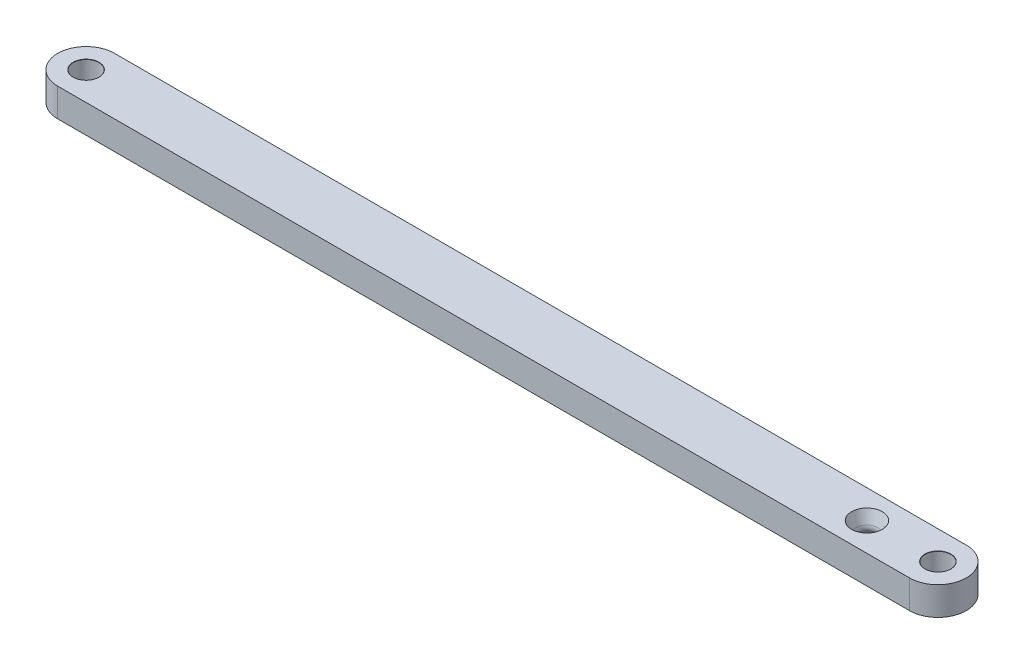
ISO-10303-21;
HEADER;
FILE_DESCRIPTION(('STEP AP214'),'2;1');
FILE_NAME('part.step','',(''),(''),'','','');
FILE_SCHEMA(('AUTOMOTIVE_DESIGN { 1 0 10303 214 1 1 1 1 }'));
ENDSEC;
DATA;
#1=APPLICATION_CONTEXT('core data for automotive mechanical design processes');
#2=APPLICATION_PROTOCOL_DEFINITION('international standard','automotive_design',2000,#1);
#3=PRODUCT_CONTEXT('',#1,'mechanical');
#4=PRODUCT('Part','Part','',(#3));
#5=PRODUCT_RELATED_PRODUCT_CATEGORY('part','',(#4));
#6=PRODUCT_DEFINITION_FORMATION('','',#4);
#7=PRODUCT_DEFINITION_CONTEXT('part definition',#1,'design');
#8=PRODUCT_DEFINITION('design','',#6,#7);
#9=PRODUCT_DEFINITION_SHAPE('','',#8);
#10=(LENGTH_UNIT() NAMED_UNIT(*) SI_UNIT(.MILLI.,.METRE.));
#11=(NAMED_UNIT(*) PLANE_ANGLE_UNIT() SI_UNIT($,.RADIAN.));
#12=(NAMED_UNIT(*) SI_UNIT($,.STERADIAN.) SOLID_ANGLE_UNIT());
#13=UNCERTAINTY_MEASURE_WITH_UNIT(LENGTH_MEASURE(1.E-05),#10,'distance_accuracy_value','');
#14=(GEOMETRIC_REPRESENTATION_CONTEXT(3) GLOBAL_UNCERTAINTY_ASSIGNED_CONTEXT((#13)) GLOBAL_UNIT_ASSIGNED_CONTEXT((#10,
#11,#12)) REPRESENTATION_CONTEXT('',''));
#15=CARTESIAN_POINT('',(0.,0.,0.));
#16=DIRECTION('',(0.,0.,1.));
#17=DIRECTION('',(1.,0.,0.));
#18=AXIS2_PLACEMENT_3D('',#15,#16,#17);
#19=CARTESIAN_POINT('',(0.,2.,0.));
#20=DIRECTION('',(0.,1.,0.));
#21=DIRECTION('',(0.,0.,1.));
#22=AXIS2_PLACEMENT_3D('',#19,#20,#21);
#23=PLANE('',#22);
#24=CARTESIAN_POINT('',(0.,2.,0.));
#25=DIRECTION('',(0.,1.,0.));
#26=DIRECTION('',(0.,0.,1.));
#27=AXIS2_PLACEMENT_3D('',#24,#25,#26);
#28=CIRCLE('',#27,1.825);
#29=CARTESIAN_POINT('',(0.,2.,1.825));
#30=VERTEX_POINT('',#29);
#31=EDGE_CURVE('E163',#30,#30,#28,.T.);
#32=ORIENTED_EDGE('',*,*,#31,.F.);
#33=EDGE_LOOP('',(#32));
#34=FACE_BOUND('',#33,.T.);
#35=CARTESIAN_POINT('',(120.,2.,0.));
#36=DIRECTION('',(0.,1.,0.));
#37=DIRECTION('',(0.,0.,1.));
#38=AXIS2_PLACEMENT_3D('',#35,#36,#37);
#39=CIRCLE('',#38,1.82499999999999);
#40=CARTESIAN_POINT('',(120.,2.,1.82499999999999));
#41=VERTEX_POINT('',#40);
#42=EDGE_CURVE('E151',#41,#41,#39,.T.);
#43=ORIENTED_EDGE('',*,*,#42,.F.);
#44=EDGE_LOOP('',(#43));
#45=FACE_BOUND('',#44,.T.);
#46=CARTESIAN_POINT('',(110.,2.,0.));
#47=DIRECTION('',(0.,1.,0.));
#48=DIRECTION('',(0.,0.,1.));
#49=AXIS2_PLACEMENT_3D('',#46,#47,#48);
#50=CIRCLE('',#49,2.1637626960565);
#51=CARTESIAN_POINT('',(110.,2.,2.1637626960565));
#52=VERTEX_POINT('',#51);
#53=EDGE_CURVE('E111',#52,#52,#50,.T.);
#54=ORIENTED_EDGE('',*,*,#53,.F.);
#55=EDGE_LOOP('',(#54));
#56=FACE_BOUND('',#55,.T.);
#57=CARTESIAN_POINT('',(0.,2.,0.));
#58=DIRECTION('',(0.,1.,0.));
#59=DIRECTION('',(0.,0.,1.));
#60=AXIS2_PLACEMENT_3D('',#57,#58,#59);
#61=CIRCLE('',#60,4.);
#62=CARTESIAN_POINT('',(0.,2.,-4.));
#63=VERTEX_POINT('',#62);
#64=CARTESIAN_POINT('',(0.,2.,4.));
#65=VERTEX_POINT('',#64);
#66=EDGE_CURVE('E91',#63,#65,#61,.T.);
#67=ORIENTED_EDGE('',*,*,#66,.T.);
#68=DIRECTION('',(1.,0.,0.));
#69=VECTOR('',#68,1.);
#70=CARTESIAN_POINT('',(0.,2.,4.));
#71=LINE('',#70,#69);
#72=CARTESIAN_POINT('',(120.,2.,4.));
#73=VERTEX_POINT('',#72);
#74=EDGE_CURVE('E87',#65,#73,#71,.T.);
#75=ORIENTED_EDGE('',*,*,#74,.T.);
#76=CARTESIAN_POINT('',(120.,2.,0.));
#77=DIRECTION('',(0.,1.,0.));
#78=DIRECTION('',(0.,0.,1.));
#79=AXIS2_PLACEMENT_3D('',#76,#77,#78);
#80=CIRCLE('',#79,4.);
#81=CARTESIAN_POINT('',(120.,2.,-4.));
#82=VERTEX_POINT('',#81);
#83=EDGE_CURVE('E89',#73,#82,#80,.T.);
#84=ORIENTED_EDGE('',*,*,#83,.T.);
#85=DIRECTION('',(-1.,0.,0.));
#86=VECTOR('',#85,1.);
#87=CARTESIAN_POINT('',(0.,2.,-4.));
#88=LINE('',#87,#86);
#89=EDGE_CURVE('E57',#82,#63,#88,.T.);
#90=ORIENTED_EDGE('',*,*,#89,.T.);
#91=EDGE_LOOP('',(#67,#75,#84,#90));
#92=FACE_BOUND('',#91,.T.);
#93=ADVANCED_FACE('F39',(#34,#45,#56,#92),#23,.T.);
#94=CARTESIAN_POINT('',(0.,-2.,0.));
#95=DIRECTION('',(0.,1.,0.));
#96=DIRECTION('',(0.,0.,1.));
#97=AXIS2_PLACEMENT_3D('',#94,#95,#96);
#98=PLANE('',#97);
#99=CARTESIAN_POINT('',(0.,-2.,0.));
#100=DIRECTION('',(0.,1.,0.));
#101=DIRECTION('',(0.,0.,1.));
#102=AXIS2_PLACEMENT_3D('',#99,#100,#101);
#103=CIRCLE('',#102,1.8);
#104=CARTESIAN_POINT('',(0.,-2.,1.8));
#105=VERTEX_POINT('',#104);
#106=EDGE_CURVE('E155',#105,#105,#103,.T.);
#107=ORIENTED_EDGE('',*,*,#106,.T.);
#108=EDGE_LOOP('',(#107));
#109=FACE_BOUND('',#108,.T.);
#110=CARTESIAN_POINT('',(120.,-2.,0.));
#111=DIRECTION('',(0.,1.,0.));
#112=DIRECTION('',(0.,0.,1.));
#113=AXIS2_PLACEMENT_3D('',#110,#111,#112);
#114=CIRCLE('',#113,1.8);
#115=CARTESIAN_POINT('',(120.,-2.,1.8));
#116=VERTEX_POINT('',#115);
#117=EDGE_CURVE('E143',#116,#116,#114,.T.);
#118=ORIENTED_EDGE('',*,*,#117,.T.);
#119=EDGE_LOOP('',(#118));
#120=FACE_BOUND('',#119,.T.);
#121=CARTESIAN_POINT('',(110.,-2.,0.));
#122=DIRECTION('',(0.,1.,0.));
#123=DIRECTION('',(0.,0.,1.));
#124=AXIS2_PLACEMENT_3D('',#121,#122,#123);
#125=CIRCLE('',#124,2.16376269605652);
#126=CARTESIAN_POINT('',(110.,-2.,2.16376269605652));
#127=VERTEX_POINT('',#126);
#128=EDGE_CURVE('E139',#127,#127,#125,.T.);
#129=ORIENTED_EDGE('',*,*,#128,.T.);
#130=EDGE_LOOP('',(#129));
#131=FACE_BOUND('',#130,.T.);
#132=CARTESIAN_POINT('',(0.,-2.,0.));
#133=DIRECTION('',(0.,1.,0.));
#134=DIRECTION('',(0.,0.,1.));
#135=AXIS2_PLACEMENT_3D('',#132,#133,#134);
#136=CIRCLE('',#135,4.);
#137=CARTESIAN_POINT('',(0.,-2.,-4.));
#138=VERTEX_POINT('',#137);
#139=CARTESIAN_POINT('',(0.,-2.,4.));
#140=VERTEX_POINT('',#139);
#141=EDGE_CURVE('E107',#138,#140,#136,.T.);
#142=ORIENTED_EDGE('',*,*,#141,.F.);
#143=DIRECTION('',(-1.,0.,0.));
#144=VECTOR('',#143,1.);
#145=CARTESIAN_POINT('',(0.,-2.,-4.));
#146=LINE('',#145,#144);
#147=CARTESIAN_POINT('',(120.,-2.,-4.));
#148=VERTEX_POINT('',#147);
#149=EDGE_CURVE('E80',#148,#138,#146,.T.);
#150=ORIENTED_EDGE('',*,*,#149,.F.);
#151=CARTESIAN_POINT('',(120.,-2.,0.));
#152=DIRECTION('',(0.,1.,0.));
#153=DIRECTION('',(0.,0.,1.));
#154=AXIS2_PLACEMENT_3D('',#151,#152,#153);
#155=CIRCLE('',#154,4.);
#156=CARTESIAN_POINT('',(120.,-2.,4.));
#157=VERTEX_POINT('',#156);
#158=EDGE_CURVE('E74',#157,#148,#155,.T.);
#159=ORIENTED_EDGE('',*,*,#158,.F.);
#160=DIRECTION('',(1.,0.,0.));
#161=VECTOR('',#160,1.);
#162=CARTESIAN_POINT('',(0.,-2.,4.));
#163=LINE('',#162,#161);
#164=EDGE_CURVE('E96',#140,#157,#163,.T.);
#165=ORIENTED_EDGE('',*,*,#164,.F.);
#166=EDGE_LOOP('',(#142,#150,#159,#165));
#167=FACE_BOUND('',#166,.T.);
#168=ADVANCED_FACE('F124',(#109,#120,#131,#167),#98,.F.);
#169=CARTESIAN_POINT('',(0.,2.,0.));
#170=DIRECTION('',(0.,-1.,0.));
#171=DIRECTION('',(0.,0.,-1.));
#172=AXIS2_PLACEMENT_3D('',#169,#170,#171);
#173=CYLINDRICAL_SURFACE('',#172,4.);
#174=ORIENTED_EDGE('',*,*,#141,.T.);
#175=DIRECTION('',(0.,-1.,0.));
#176=VECTOR('',#175,1.);
#177=CARTESIAN_POINT('',(0.,2.,4.));
#178=LINE('',#177,#176);
#179=EDGE_CURVE('E11',#65,#140,#178,.T.);
#180=ORIENTED_EDGE('',*,*,#179,.F.);
#181=ORIENTED_EDGE('',*,*,#66,.F.);
#182=DIRECTION('',(0.,-1.,0.));
#183=VECTOR('',#182,1.);
#184=CARTESIAN_POINT('',(0.,2.,-4.));
#185=LINE('',#184,#183);
#186=EDGE_CURVE('E103',#63,#138,#185,.T.);
#187=ORIENTED_EDGE('',*,*,#186,.T.);
#188=EDGE_LOOP('',(#174,#180,#181,#187));
#189=FACE_BOUND('',#188,.T.);
#190=ADVANCED_FACE('F41',(#189),#173,.T.);
#191=CARTESIAN_POINT('',(0.,2.,4.));
#192=DIRECTION('',(0.,0.,-1.));
#193=DIRECTION('',(-1.,0.,0.));
#194=AXIS2_PLACEMENT_3D('',#191,#192,#193);
#195=PLANE('',#194);
#196=ORIENTED_EDGE('',*,*,#164,.T.);
#197=DIRECTION('',(0.,-1.,0.));
#198=VECTOR('',#197,1.);
#199=CARTESIAN_POINT('',(120.,2.,4.));
#200=LINE('',#199,#198);
#201=EDGE_CURVE('E49',#73,#157,#200,.T.);
#202=ORIENTED_EDGE('',*,*,#201,.F.);
#203=ORIENTED_EDGE('',*,*,#74,.F.);
#204=ORIENTED_EDGE('',*,*,#179,.T.);
#205=EDGE_LOOP('',(#196,#202,#203,#204));
#206=FACE_BOUND('',#205,.T.);
#207=ADVANCED_FACE('F95',(#206),#195,.F.);
#208=CARTESIAN_POINT('',(120.,2.,0.));
#209=DIRECTION('',(0.,-1.,0.));
#210=DIRECTION('',(0.,0.,-1.));
#211=AXIS2_PLACEMENT_3D('',#208,#209,#210);
#212=CYLINDRICAL_SURFACE('',#211,4.);
#213=ORIENTED_EDGE('',*,*,#158,.T.);
#214=DIRECTION('',(0.,-1.,0.));
#215=VECTOR('',#214,1.);
#216=CARTESIAN_POINT('',(120.,2.,-4.));
#217=LINE('',#216,#215);
#218=EDGE_CURVE('E98',#82,#148,#217,.T.);
#219=ORIENTED_EDGE('',*,*,#218,.F.);
#220=ORIENTED_EDGE('',*,*,#83,.F.);
#221=ORIENTED_EDGE('',*,*,#201,.T.);
#222=EDGE_LOOP('',(#213,#219,#220,#221));
#223=FACE_BOUND('',#222,.T.);
#224=ADVANCED_FACE('F99',(#223),#212,.T.);
#225=CARTESIAN_POINT('',(0.,2.,-4.));
#226=DIRECTION('',(0.,0.,1.));
#227=DIRECTION('',(1.,0.,0.));
#228=AXIS2_PLACEMENT_3D('',#225,#226,#227);
#229=PLANE('',#228);
#230=ORIENTED_EDGE('',*,*,#149,.T.);
#231=ORIENTED_EDGE('',*,*,#186,.F.);
#232=ORIENTED_EDGE('',*,*,#89,.F.);
#233=ORIENTED_EDGE('',*,*,#218,.T.);
#234=EDGE_LOOP('',(#230,#231,#232,#233));
#235=FACE_BOUND('',#234,.T.);
#236=ADVANCED_FACE('F121',(#235),#229,.F.);
#237=CARTESIAN_POINT('',(110.,0.342020143325657,0.));
#238=DIRECTION('',(0.,1.,0.));
#239=DIRECTION('',(0.,0.,1.));
#240=AXIS2_PLACEMENT_3D('',#237,#238,#239);
#241=CONICAL_SURFACE('',#240,1.56030737921413,0.34906585039885);
#242=ORIENTED_EDGE('',*,*,#53,.T.);
#243=EDGE_LOOP('',(#242));
#244=FACE_BOUND('',#243,.T.);
#245=CARTESIAN_POINT('',(110.,0.342020143325657,0.));
#246=DIRECTION('',(0.,1.,0.));
#247=DIRECTION('',(0.,0.,1.));
#248=AXIS2_PLACEMENT_3D('',#245,#246,#247);
#249=CIRCLE('',#248,1.56030737921413);
#250=CARTESIAN_POINT('',(110.,0.342020143325657,1.56030737921413));
#251=VERTEX_POINT('',#250);
#252=EDGE_CURVE('E131',#251,#251,#249,.T.);
#253=ORIENTED_EDGE('',*,*,#252,.F.);
#254=EDGE_LOOP('',(#253));
#255=FACE_BOUND('',#254,.T.);
#256=ADVANCED_FACE('F177',(#244,#255),#241,.F.);
#257=CARTESIAN_POINT('',(110.,0.,0.));
#258=DIRECTION('',(0.,1.,0.));
#259=DIRECTION('',(0.,0.,1.));
#260=AXIS2_PLACEMENT_3D('',#257,#258,#259);
#261=TOROIDAL_SURFACE('',#260,2.5,0.999999999999963);
#262=ORIENTED_EDGE('',*,*,#252,.T.);
#263=EDGE_LOOP('',(#262));
#264=FACE_BOUND('',#263,.T.);
#265=CARTESIAN_POINT('',(110.,-0.342020143325657,0.));
#266=DIRECTION('',(0.,1.,0.));
#267=DIRECTION('',(0.,0.,1.));
#268=AXIS2_PLACEMENT_3D('',#265,#266,#267);
#269=CIRCLE('',#268,1.56030737921413);
#270=CARTESIAN_POINT('',(110.,-0.342020143325657,1.56030737921413));
#271=VERTEX_POINT('',#270);
#272=EDGE_CURVE('E135',#271,#271,#269,.T.);
#273=ORIENTED_EDGE('',*,*,#272,.F.);
#274=EDGE_LOOP('',(#273));
#275=FACE_BOUND('',#274,.T.);
#276=ADVANCED_FACE('F180',(#264,#275),#261,.T.);
#277=CARTESIAN_POINT('',(110.,-2.,0.));
#278=DIRECTION('',(0.,-1.,0.));
#279=DIRECTION('',(0.,0.,-1.));
#280=AXIS2_PLACEMENT_3D('',#277,#278,#279);
#281=CONICAL_SURFACE('',#280,2.16376269605652,0.349065850398857);
#282=ORIENTED_EDGE('',*,*,#272,.T.);
#283=EDGE_LOOP('',(#282));
#284=FACE_BOUND('',#283,.T.);
#285=ORIENTED_EDGE('',*,*,#128,.F.);
#286=EDGE_LOOP('',(#285));
#287=FACE_BOUND('',#286,.T.);
#288=ADVANCED_FACE('F186',(#284,#287),#281,.F.);
#289=CARTESIAN_POINT('',(120.,2.,0.));
#290=DIRECTION('',(0.,1.,0.));
#291=DIRECTION('',(0.,0.,1.));
#292=AXIS2_PLACEMENT_3D('',#289,#290,#291);
#293=CYLINDRICAL_SURFACE('',#292,1.8);
#294=ORIENTED_EDGE('',*,*,#117,.F.);
#295=EDGE_LOOP('',(#294));
#296=FACE_BOUND('',#295,.T.);
#297=CARTESIAN_POINT('',(120.,1.975,0.));
#298=DIRECTION('',(0.,1.,0.));
#299=DIRECTION('',(0.,0.,1.));
#300=AXIS2_PLACEMENT_3D('',#297,#298,#299);
#301=CIRCLE('',#300,1.8);
#302=CARTESIAN_POINT('',(120.,1.975,1.8));
#303=VERTEX_POINT('',#302);
#304=EDGE_CURVE('E147',#303,#303,#301,.T.);
#305=ORIENTED_EDGE('',*,*,#304,.T.);
#306=EDGE_LOOP('',(#305));
#307=FACE_BOUND('',#306,.T.);
#308=ADVANCED_FACE('F192',(#296,#307),#293,.F.);
#309=CARTESIAN_POINT('',(120.,2.,0.));
#310=DIRECTION('',(0.,1.,0.));
#311=DIRECTION('',(0.,0.,1.));
#312=AXIS2_PLACEMENT_3D('',#309,#310,#311);
#313=CONICAL_SURFACE('',#312,1.82499999999999,0.785398163397379);
#314=ORIENTED_EDGE('',*,*,#304,.F.);
#315=EDGE_LOOP('',(#314));
#316=FACE_BOUND('',#315,.T.);
#317=ORIENTED_EDGE('',*,*,#42,.T.);
#318=EDGE_LOOP('',(#317));
#319=FACE_BOUND('',#318,.T.);
#320=ADVANCED_FACE('F239',(#316,#319),#313,.F.);
#321=CARTESIAN_POINT('',(0.,2.,0.));
#322=DIRECTION('',(0.,1.,0.));
#323=DIRECTION('',(0.,0.,1.));
#324=AXIS2_PLACEMENT_3D('',#321,#322,#323);
#325=CYLINDRICAL_SURFACE('',#324,1.8);
#326=ORIENTED_EDGE('',*,*,#106,.F.);
#327=EDGE_LOOP('',(#326));
#328=FACE_BOUND('',#327,.T.);
#329=CARTESIAN_POINT('',(0.,1.975,0.));
#330=DIRECTION('',(0.,1.,0.));
#331=DIRECTION('',(0.,0.,1.));
#332=AXIS2_PLACEMENT_3D('',#329,#330,#331);
#333=CIRCLE('',#332,1.8);
#334=CARTESIAN_POINT('',(0.,1.975,1.8));
#335=VERTEX_POINT('',#334);
#336=EDGE_CURVE('E159',#335,#335,#333,.T.);
#337=ORIENTED_EDGE('',*,*,#336,.T.);
#338=EDGE_LOOP('',(#337));
#339=FACE_BOUND('',#338,.T.);
#340=ADVANCED_FACE('F247',(#328,#339),#325,.F.);
#341=CARTESIAN_POINT('',(0.,2.,0.));
#342=DIRECTION('',(0.,1.,0.));
#343=DIRECTION('',(0.,0.,1.));
#344=AXIS2_PLACEMENT_3D('',#341,#342,#343);
#345=CONICAL_SURFACE('',#344,1.825,0.785398163397479);
#346=ORIENTED_EDGE('',*,*,#336,.F.);
#347=EDGE_LOOP('',(#346));
#348=FACE_BOUND('',#347,.T.);
#349=ORIENTED_EDGE('',*,*,#31,.T.);
#350=EDGE_LOOP('',(#349));
#351=FACE_BOUND('',#350,.T.);
#352=ADVANCED_FACE('F168',(#348,#351),#345,.F.);
#353=CLOSED_SHELL('',(#93,#168,#190,#207,#224,#236,#256,#276,#288,#308,#320,#340,#352));
#354=MANIFOLD_SOLID_BREP('B2',#353);
#355=ADVANCED_BREP_SHAPE_REPRESENTATION('',(#18,#354),#14);
#356=SHAPE_DEFINITION_REPRESENTATION(#9,#355);
ENDSEC;
END-ISO-10303-21;
